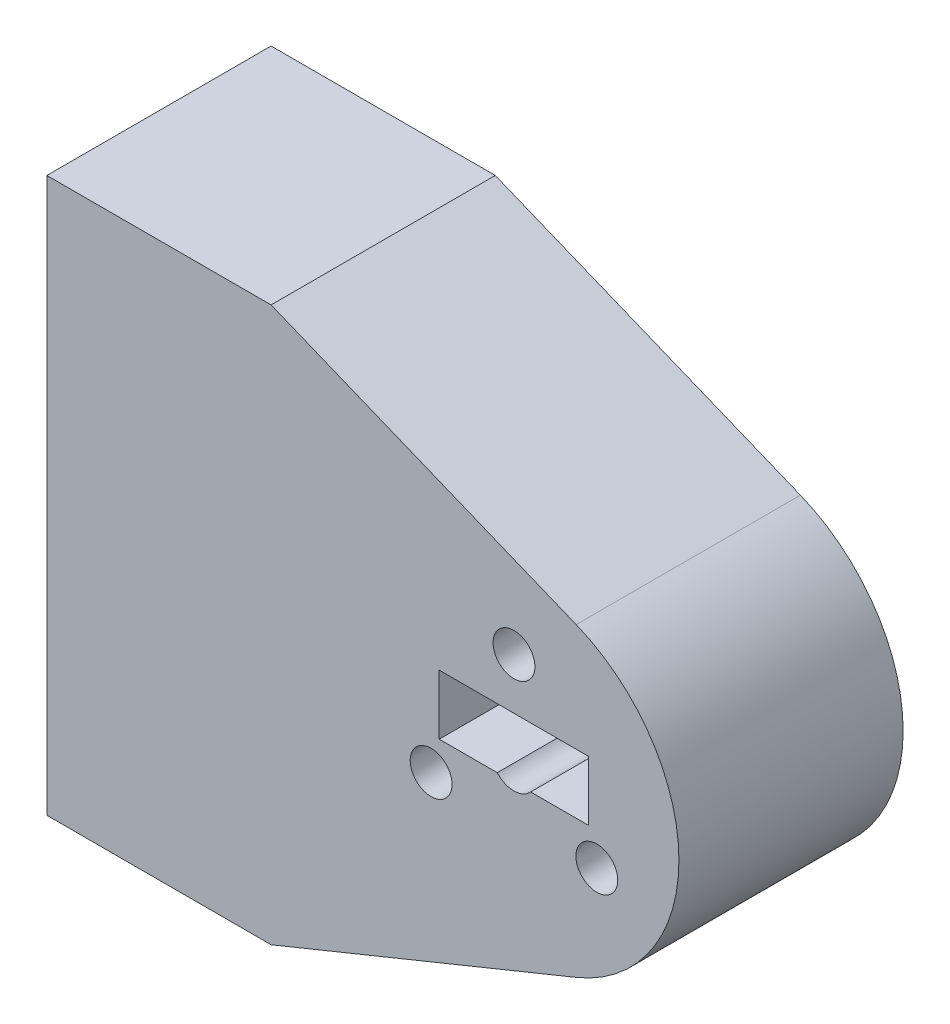
ISO-10303-21;
HEADER;
FILE_DESCRIPTION(('STEP AP214'),'2;1');
FILE_NAME('part.step','',(''),(''),'','','');
FILE_SCHEMA(('AUTOMOTIVE_DESIGN { 1 0 10303 214 1 1 1 1 }'));
ENDSEC;
DATA;
#1=APPLICATION_CONTEXT('core data for automotive mechanical design processes');
#2=APPLICATION_PROTOCOL_DEFINITION('international standard','automotive_design',2000,#1);
#3=PRODUCT_CONTEXT('',#1,'mechanical');
#4=PRODUCT('Part','Part','',(#3));
#5=PRODUCT_RELATED_PRODUCT_CATEGORY('part','',(#4));
#6=PRODUCT_DEFINITION_FORMATION('','',#4);
#7=PRODUCT_DEFINITION_CONTEXT('part definition',#1,'design');
#8=PRODUCT_DEFINITION('design','',#6,#7);
#9=PRODUCT_DEFINITION_SHAPE('','',#8);
#10=(LENGTH_UNIT() NAMED_UNIT(*) SI_UNIT(.MILLI.,.METRE.));
#11=(NAMED_UNIT(*) PLANE_ANGLE_UNIT() SI_UNIT($,.RADIAN.));
#12=(NAMED_UNIT(*) SI_UNIT($,.STERADIAN.) SOLID_ANGLE_UNIT());
#13=UNCERTAINTY_MEASURE_WITH_UNIT(LENGTH_MEASURE(1.E-05),#10,'distance_accuracy_value','');
#14=(GEOMETRIC_REPRESENTATION_CONTEXT(3) GLOBAL_UNCERTAINTY_ASSIGNED_CONTEXT((#13)) GLOBAL_UNIT_ASSIGNED_CONTEXT((#10,
#11,#12)) REPRESENTATION_CONTEXT('',''));
#15=CARTESIAN_POINT('',(0.,0.,0.));
#16=DIRECTION('',(0.,0.,1.));
#17=DIRECTION('',(1.,0.,0.));
#18=AXIS2_PLACEMENT_3D('',#15,#16,#17);
#19=CARTESIAN_POINT('',(0.,-2.,5.));
#20=DIRECTION('',(0.,-1.,0.));
#21=DIRECTION('',(1.,0.,0.));
#22=AXIS2_PLACEMENT_3D('',#19,#20,#21);
#23=PLANE('',#22);
#24=DIRECTION('',(0.,0.,1.));
#25=VECTOR('',#24,1.);
#26=CARTESIAN_POINT('',(-4.50941227933137,-2.,10.));
#27=LINE('',#26,#25);
#28=CARTESIAN_POINT('',(-4.50941227933137,-2.,0.));
#29=VERTEX_POINT('',#28);
#30=CARTESIAN_POINT('',(-4.50941227933137,-2.,12.));
#31=VERTEX_POINT('',#30);
#32=EDGE_CURVE('E450',#29,#31,#27,.T.);
#33=ORIENTED_EDGE('',*,*,#32,.T.);
#34=DIRECTION('',(-1.,0.,0.));
#35=VECTOR('',#34,1.);
#36=CARTESIAN_POINT('',(0.,-2.,12.));
#37=LINE('',#36,#35);
#38=CARTESIAN_POINT('',(-10.,-2.,12.));
#39=VERTEX_POINT('',#38);
#40=EDGE_CURVE('E433',#31,#39,#37,.T.);
#41=ORIENTED_EDGE('',*,*,#40,.T.);
#42=DIRECTION('',(0.,0.,-1.));
#43=VECTOR('',#42,1.);
#44=CARTESIAN_POINT('',(-10.,-2.,5.));
#45=LINE('',#44,#43);
#46=CARTESIAN_POINT('',(-10.,-2.,30.));
#47=VERTEX_POINT('',#46);
#48=EDGE_CURVE('E331',#47,#39,#45,.T.);
#49=ORIENTED_EDGE('',*,*,#48,.F.);
#50=DIRECTION('',(-1.,0.,0.));
#51=VECTOR('',#50,1.);
#52=CARTESIAN_POINT('',(0.,-2.,30.));
#53=LINE('',#52,#51);
#54=CARTESIAN_POINT('',(-2.23606797749979,-2.,30.));
#55=VERTEX_POINT('',#54);
#56=EDGE_CURVE('E264',#55,#47,#53,.T.);
#57=ORIENTED_EDGE('',*,*,#56,.F.);
#58=DIRECTION('',(0.,0.,-1.));
#59=VECTOR('',#58,1.);
#60=CARTESIAN_POINT('',(-2.23606797749979,-2.,5.));
#61=LINE('',#60,#59);
#62=CARTESIAN_POINT('',(-2.23606797749979,-2.,0.));
#63=VERTEX_POINT('',#62);
#64=EDGE_CURVE('E334',#55,#63,#61,.T.);
#65=ORIENTED_EDGE('',*,*,#64,.T.);
#66=DIRECTION('',(-1.,0.,0.));
#67=VECTOR('',#66,1.);
#68=CARTESIAN_POINT('',(0.,-2.,0.));
#69=LINE('',#68,#67);
#70=EDGE_CURVE('E306',#63,#29,#69,.T.);
#71=ORIENTED_EDGE('',*,*,#70,.T.);
#72=EDGE_LOOP('',(#33,#41,#49,#57,#65,#71));
#73=FACE_BOUND('',#72,.T.);
#74=ADVANCED_FACE('F46',(#73),#23,.F.);
#75=CARTESIAN_POINT('',(-10.,0.,5.));
#76=DIRECTION('',(1.,0.,0.));
#77=DIRECTION('',(0.,0.,-1.));
#78=AXIS2_PLACEMENT_3D('',#75,#76,#77);
#79=PLANE('',#78);
#80=DIRECTION('',(0.,-1.,0.));
#81=VECTOR('',#80,1.);
#82=CARTESIAN_POINT('',(-10.,-1.51916980741839,12.));
#83=LINE('',#82,#81);
#84=CARTESIAN_POINT('',(-10.,0.539957063453597,12.));
#85=VERTEX_POINT('',#84);
#86=EDGE_CURVE('E399',#39,#85,#83,.F.);
#87=ORIENTED_EDGE('',*,*,#86,.T.);
#88=DIRECTION('',(0.,0.,-1.));
#89=VECTOR('',#88,1.);
#90=CARTESIAN_POINT('',(-10.,0.539957063453597,5.));
#91=LINE('',#90,#89);
#92=CARTESIAN_POINT('',(-10.,0.539957063453597,0.));
#93=VERTEX_POINT('',#92);
#94=EDGE_CURVE('E516',#85,#93,#91,.T.);
#95=ORIENTED_EDGE('',*,*,#94,.T.);
#96=DIRECTION('',(0.,-1.,0.));
#97=VECTOR('',#96,1.);
#98=CARTESIAN_POINT('',(-10.,0.,0.));
#99=LINE('',#98,#97);
#100=CARTESIAN_POINT('',(-10.,6.,0.));
#101=VERTEX_POINT('',#100);
#102=EDGE_CURVE('E309',#101,#93,#99,.T.);
#103=ORIENTED_EDGE('',*,*,#102,.F.);
#104=DIRECTION('',(0.,0.,-1.));
#105=VECTOR('',#104,1.);
#106=CARTESIAN_POINT('',(-10.,6.,5.));
#107=LINE('',#106,#105);
#108=CARTESIAN_POINT('',(-10.,6.,30.));
#109=VERTEX_POINT('',#108);
#110=EDGE_CURVE('E329',#109,#101,#107,.T.);
#111=ORIENTED_EDGE('',*,*,#110,.F.);
#112=DIRECTION('',(0.,-1.,0.));
#113=VECTOR('',#112,1.);
#114=CARTESIAN_POINT('',(-10.,0.,30.));
#115=LINE('',#114,#113);
#116=EDGE_CURVE('E267',#109,#47,#115,.T.);
#117=ORIENTED_EDGE('',*,*,#116,.T.);
#118=ORIENTED_EDGE('',*,*,#48,.T.);
#119=EDGE_LOOP('',(#87,#95,#103,#111,#117,#118));
#120=FACE_BOUND('',#119,.T.);
#121=ADVANCED_FACE('F464',(#120),#79,.T.);
#122=CARTESIAN_POINT('',(10.,0.,5.));
#123=DIRECTION('',(1.,0.,0.));
#124=DIRECTION('',(0.,1.,0.));
#125=AXIS2_PLACEMENT_3D('',#122,#123,#124);
#126=PLANE('',#125);
#127=DIRECTION('',(0.,-1.,0.));
#128=VECTOR('',#127,1.);
#129=CARTESIAN_POINT('',(10.,0.,0.));
#130=LINE('',#129,#128);
#131=CARTESIAN_POINT('',(10.,6.,0.));
#132=VERTEX_POINT('',#131);
#133=CARTESIAN_POINT('',(10.,0.539957063453604,0.));
#134=VERTEX_POINT('',#133);
#135=EDGE_CURVE('E316',#132,#134,#130,.T.);
#136=ORIENTED_EDGE('',*,*,#135,.T.);
#137=DIRECTION('',(0.,0.,1.));
#138=VECTOR('',#137,1.);
#139=CARTESIAN_POINT('',(10.,0.539957063453604,10.));
#140=LINE('',#139,#138);
#141=CARTESIAN_POINT('',(10.,0.539957063453604,12.));
#142=VERTEX_POINT('',#141);
#143=EDGE_CURVE('E356',#134,#142,#140,.T.);
#144=ORIENTED_EDGE('',*,*,#143,.T.);
#145=DIRECTION('',(0.,-1.,0.));
#146=VECTOR('',#145,1.);
#147=CARTESIAN_POINT('',(10.,0.,12.));
#148=LINE('',#147,#146);
#149=CARTESIAN_POINT('',(10.,-2.,12.));
#150=VERTEX_POINT('',#149);
#151=EDGE_CURVE('E354',#142,#150,#148,.T.);
#152=ORIENTED_EDGE('',*,*,#151,.T.);
#153=DIRECTION('',(0.,0.,-1.));
#154=VECTOR('',#153,1.);
#155=CARTESIAN_POINT('',(10.,-2.,5.));
#156=LINE('',#155,#154);
#157=CARTESIAN_POINT('',(10.,-2.,30.));
#158=VERTEX_POINT('',#157);
#159=EDGE_CURVE('E324',#158,#150,#156,.T.);
#160=ORIENTED_EDGE('',*,*,#159,.F.);
#161=DIRECTION('',(0.,-1.,0.));
#162=VECTOR('',#161,1.);
#163=CARTESIAN_POINT('',(10.,0.,30.));
#164=LINE('',#163,#162);
#165=CARTESIAN_POINT('',(10.,6.,30.));
#166=VERTEX_POINT('',#165);
#167=EDGE_CURVE('E273',#166,#158,#164,.T.);
#168=ORIENTED_EDGE('',*,*,#167,.F.);
#169=DIRECTION('',(0.,0.,-1.));
#170=VECTOR('',#169,1.);
#171=CARTESIAN_POINT('',(10.,6.,5.));
#172=LINE('',#171,#170);
#173=EDGE_CURVE('E327',#166,#132,#172,.T.);
#174=ORIENTED_EDGE('',*,*,#173,.T.);
#175=EDGE_LOOP('',(#136,#144,#152,#160,#168,#174));
#176=FACE_BOUND('',#175,.T.);
#177=ADVANCED_FACE('F467',(#176),#126,.F.);
#178=DIRECTION('',(-1.,0.,0.));
#179=VECTOR('',#178,1.);
#180=CARTESIAN_POINT('',(0.,-2.,12.));
#181=LINE('',#180,#179);
#182=CARTESIAN_POINT('',(4.50941227933138,-2.,12.));
#183=VERTEX_POINT('',#182);
#184=EDGE_CURVE('E346',#150,#183,#181,.T.);
#185=ORIENTED_EDGE('',*,*,#184,.T.);
#186=DIRECTION('',(0.,0.,1.));
#187=VECTOR('',#186,1.);
#188=CARTESIAN_POINT('',(4.50941227933138,-2.,0.));
#189=LINE('',#188,#187);
#190=CARTESIAN_POINT('',(4.50941227933138,-2.,0.));
#191=VERTEX_POINT('',#190);
#192=EDGE_CURVE('E348',#183,#191,#189,.F.);
#193=ORIENTED_EDGE('',*,*,#192,.T.);
#194=CARTESIAN_POINT('',(2.23606797749979,-2.,0.));
#195=VERTEX_POINT('',#194);
#196=EDGE_CURVE('E310',#191,#195,#69,.T.);
#197=ORIENTED_EDGE('',*,*,#196,.T.);
#198=DIRECTION('',(0.,0.,-1.));
#199=VECTOR('',#198,1.);
#200=CARTESIAN_POINT('',(2.23606797749979,-2.,5.));
#201=LINE('',#200,#199);
#202=CARTESIAN_POINT('',(2.23606797749979,-2.,30.));
#203=VERTEX_POINT('',#202);
#204=EDGE_CURVE('E321',#203,#195,#201,.T.);
#205=ORIENTED_EDGE('',*,*,#204,.F.);
#206=DIRECTION('',(-1.,0.,0.));
#207=VECTOR('',#206,1.);
#208=CARTESIAN_POINT('',(0.,-2.,30.));
#209=LINE('',#208,#207);
#210=EDGE_CURVE('E276',#158,#203,#209,.T.);
#211=ORIENTED_EDGE('',*,*,#210,.F.);
#212=ORIENTED_EDGE('',*,*,#159,.T.);
#213=EDGE_LOOP('',(#185,#193,#197,#205,#211,#212));
#214=FACE_BOUND('',#213,.T.);
#215=ADVANCED_FACE('F466',(#214),#23,.F.);
#216=CARTESIAN_POINT('',(0.,0.,5.));
#217=DIRECTION('',(0.,0.,-1.));
#218=DIRECTION('',(-1.,0.,0.));
#219=AXIS2_PLACEMENT_3D('',#216,#217,#218);
#220=CYLINDRICAL_SURFACE('',#219,3.);
#221=CARTESIAN_POINT('',(0.,0.,0.));
#222=DIRECTION('',(0.,0.,1.));
#223=DIRECTION('',(1.,0.,0.));
#224=AXIS2_PLACEMENT_3D('',#221,#222,#223);
#225=CIRCLE('',#224,3.);
#226=EDGE_CURVE('E227',#63,#195,#225,.T.);
#227=ORIENTED_EDGE('',*,*,#226,.F.);
#228=ORIENTED_EDGE('',*,*,#64,.F.);
#229=CARTESIAN_POINT('',(0.,0.,30.));
#230=DIRECTION('',(0.,0.,1.));
#231=DIRECTION('',(1.,0.,0.));
#232=AXIS2_PLACEMENT_3D('',#229,#230,#231);
#233=CIRCLE('',#232,3.);
#234=EDGE_CURVE('E261',#55,#203,#233,.T.);
#235=ORIENTED_EDGE('',*,*,#234,.T.);
#236=ORIENTED_EDGE('',*,*,#204,.T.);
#237=EDGE_LOOP('',(#227,#228,#235,#236));
#238=FACE_BOUND('',#237,.T.);
#239=ADVANCED_FACE('F475',(#238),#220,.F.);
#240=CARTESIAN_POINT('',(0.,6.,5.));
#241=DIRECTION('',(0.,-1.,0.));
#242=DIRECTION('',(1.,0.,0.));
#243=AXIS2_PLACEMENT_3D('',#240,#241,#242);
#244=PLANE('',#243);
#245=DIRECTION('',(-1.,0.,0.));
#246=VECTOR('',#245,1.);
#247=CARTESIAN_POINT('',(0.,6.,0.));
#248=LINE('',#247,#246);
#249=EDGE_CURVE('E313',#132,#101,#248,.T.);
#250=ORIENTED_EDGE('',*,*,#249,.F.);
#251=ORIENTED_EDGE('',*,*,#173,.F.);
#252=DIRECTION('',(-1.,0.,0.));
#253=VECTOR('',#252,1.);
#254=CARTESIAN_POINT('',(0.,6.,30.));
#255=LINE('',#254,#253);
#256=EDGE_CURVE('E270',#166,#109,#255,.T.);
#257=ORIENTED_EDGE('',*,*,#256,.T.);
#258=ORIENTED_EDGE('',*,*,#110,.T.);
#259=EDGE_LOOP('',(#250,#251,#257,#258));
#260=FACE_BOUND('',#259,.T.);
#261=ADVANCED_FACE('F471',(#260),#244,.T.);
#262=CARTESIAN_POINT('',(0.,12.8,5.));
#263=DIRECTION('',(0.,0.,-1.));
#264=DIRECTION('',(-1.,0.,0.));
#265=AXIS2_PLACEMENT_3D('',#262,#263,#264);
#266=CYLINDRICAL_SURFACE('',#265,2.8);
#267=CARTESIAN_POINT('',(0.,12.8,10.));
#268=DIRECTION('',(0.,0.,1.));
#269=DIRECTION('',(1.,0.,0.));
#270=AXIS2_PLACEMENT_3D('',#267,#268,#269);
#271=CIRCLE('',#270,2.8);
#272=CARTESIAN_POINT('',(2.8,12.8,10.));
#273=VERTEX_POINT('',#272);
#274=EDGE_CURVE('E562',#273,#273,#271,.T.);
#275=ORIENTED_EDGE('',*,*,#274,.F.);
#276=EDGE_LOOP('',(#275));
#277=FACE_BOUND('',#276,.T.);
#278=CARTESIAN_POINT('',(0.,12.8,30.));
#279=DIRECTION('',(0.,0.,1.));
#280=DIRECTION('',(1.,0.,0.));
#281=AXIS2_PLACEMENT_3D('',#278,#279,#280);
#282=CIRCLE('',#281,2.8);
#283=CARTESIAN_POINT('',(2.8,12.8,30.));
#284=VERTEX_POINT('',#283);
#285=EDGE_CURVE('E282',#284,#284,#282,.T.);
#286=ORIENTED_EDGE('',*,*,#285,.T.);
#287=EDGE_LOOP('',(#286));
#288=FACE_BOUND('',#287,.T.);
#289=ADVANCED_FACE('F474',(#277,#288),#266,.F.);
#290=CARTESIAN_POINT('',(11.0851251684408,-6.4,5.));
#291=DIRECTION('',(0.,0.,-1.));
#292=DIRECTION('',(-1.,0.,0.));
#293=AXIS2_PLACEMENT_3D('',#290,#291,#292);
#294=CYLINDRICAL_SURFACE('',#293,2.8);
#295=CARTESIAN_POINT('',(9.64290465825522,-4.,10.));
#296=CARTESIAN_POINT('',(9.71595331281925,-3.95609055605296,10.0000281592697));
#297=CARTESIAN_POINT('',(9.79099210247767,-3.91554992561453,10.0014468254999));
#298=CARTESIAN_POINT('',(9.94440435266807,-3.84148600769928,10.0059389361194));
#299=CARTESIAN_POINT('',(10.0227774899307,-3.80796204180481,10.0090122204265));
#300=CARTESIAN_POINT('',(10.1823346580155,-3.74816229926325,10.0156922707784));
#301=CARTESIAN_POINT('',(10.2635223346542,-3.72189635167612,10.0192997501992));
#302=CARTESIAN_POINT('',(10.4279625414964,-3.67687668465826,10.0261426076969));
#303=CARTESIAN_POINT('',(10.511214793816,-3.65812196001168,10.0293780355235));
#304=CARTESIAN_POINT('',(10.6722687707974,-3.62949748597757,10.0345686451862));
#305=CARTESIAN_POINT('',(10.7499618004399,-3.61902823438684,10.0366066701281));
#306=CARTESIAN_POINT('',(10.9059732976984,-3.60463965252869,10.0394529055451));
#307=CARTESIAN_POINT('',(10.9842917217428,-3.60071986988606,10.0402612009578));
#308=CARTESIAN_POINT('',(11.1407479490428,-3.59946262949336,10.0405179622064));
#309=CARTESIAN_POINT('',(11.2188856031876,-3.60210577923344,10.0399704343157));
#310=CARTESIAN_POINT('',(11.3746139455313,-3.6139117610874,10.0376104773647));
#311=CARTESIAN_POINT('',(11.4522049355271,-3.62307065528124,10.0357988123236));
#312=CARTESIAN_POINT('',(11.5510582036142,-3.63895025644878,10.0328561932886));
#313=CARTESIAN_POINT('',(11.5728353132911,-3.64271373732277,10.0321679743866));
#314=CARTESIAN_POINT('',(11.6162779991363,-3.65075212241644,10.0307252816472));
#315=CARTESIAN_POINT('',(11.637943638925,-3.65502669060543,10.0299708514283));
#316=CARTESIAN_POINT('',(11.6595569458353,-3.65955694583533,10.029188358348));
#317=B_SPLINE_CURVE_WITH_KNOTS('',3,(#295,#296,#297,#298,#299,#300,#301,#302,#303,#304,#305,
#306,#307,#308,#309,#310,#311,#312,#313,#314,#315,#316),.UNSPECIFIED.,.F.,.F.,(4,2,2,2,2,2,2,2,
2,2,4),(0.,0.255549945472919,0.511075171257021,0.766944760933173,1.02278009650965,
1.25776703437204,1.49273774089419,1.72701496990269,1.96115072895215,2.02747859800106,
2.09376309502978),.UNSPECIFIED.);
#318=CARTESIAN_POINT('',(9.64290465825522,-4.,10.));
#319=VERTEX_POINT('',#318);
#320=CARTESIAN_POINT('',(11.6595569458353,-3.65955694583533,10.029188358348));
#321=VERTEX_POINT('',#320);
#322=EDGE_CURVE('E358',#319,#321,#317,.T.);
#323=ORIENTED_EDGE('',*,*,#322,.T.);
#324=CARTESIAN_POINT('',(11.6595569458353,-3.65955694583533,10.029188358348));
#325=CARTESIAN_POINT('',(11.6881514593597,-3.66554934271509,10.0242476200698));
#326=CARTESIAN_POINT('',(11.7167568808624,-3.67201397382296,10.019948368373));
#327=CARTESIAN_POINT('',(11.773824438666,-3.68586087938667,10.0126226629916));
#328=CARTESIAN_POINT('',(11.8022867528253,-3.69324059203717,10.0095927555217));
#329=CARTESIAN_POINT('',(11.8590600724687,-3.70892361366138,10.0047687727579));
#330=CARTESIAN_POINT('',(11.8873710806353,-3.71722690620408,10.0029746754824));
#331=CARTESIAN_POINT('',(11.9438403848506,-3.7347633569666,10.0005881059124));
#332=CARTESIAN_POINT('',(11.9719980479484,-3.74399900634198,9.99999894729568));
#333=CARTESIAN_POINT('',(12.,-3.75368103914521,10.));
#334=B_SPLINE_CURVE_WITH_KNOTS('',3,(#324,#325,#326,#327,#328,#329,#330,#331,#332,#333),
.UNSPECIFIED.,.F.,.F.,(4,2,2,2,4),(0.,0.0888794952683908,0.177515560624598,0.266150049345435,
0.355027964007127),.UNSPECIFIED.);
#335=CARTESIAN_POINT('',(12.,-3.75368103914521,10.));
#336=VERTEX_POINT('',#335);
#337=EDGE_CURVE('E365',#321,#336,#334,.T.);
#338=ORIENTED_EDGE('',*,*,#337,.T.);
#339=CARTESIAN_POINT('',(11.0851251684408,-6.4,10.));
#340=DIRECTION('',(0.,0.,1.));
#341=DIRECTION('',(1.,0.,0.));
#342=AXIS2_PLACEMENT_3D('',#339,#340,#341);
#343=CIRCLE('',#342,2.8);
#344=EDGE_CURVE('E556',#319,#336,#343,.T.);
#345=ORIENTED_EDGE('',*,*,#344,.F.);
#346=EDGE_LOOP('',(#323,#338,#345));
#347=FACE_BOUND('',#346,.T.);
#348=CARTESIAN_POINT('',(11.0851251684408,-6.4,30.));
#349=DIRECTION('',(0.,0.,1.));
#350=DIRECTION('',(1.,0.,0.));
#351=AXIS2_PLACEMENT_3D('',#348,#349,#350);
#352=CIRCLE('',#351,2.8);
#353=CARTESIAN_POINT('',(13.8851251684408,-6.4,30.));
#354=VERTEX_POINT('',#353);
#355=EDGE_CURVE('E258',#354,#354,#352,.T.);
#356=ORIENTED_EDGE('',*,*,#355,.T.);
#357=EDGE_LOOP('',(#356));
#358=FACE_BOUND('',#357,.T.);
#359=ADVANCED_FACE('F371',(#347,#358),#294,.F.);
#360=CARTESIAN_POINT('',(-11.0851251684408,-6.40000000000001,5.));
#361=DIRECTION('',(0.,0.,-1.));
#362=DIRECTION('',(-1.,0.,0.));
#363=AXIS2_PLACEMENT_3D('',#360,#361,#362);
#364=CYLINDRICAL_SURFACE('',#363,2.8);
#365=CARTESIAN_POINT('',(-11.0851251684408,-6.40000000000001,10.));
#366=DIRECTION('',(0.,0.,1.));
#367=DIRECTION('',(1.,0.,0.));
#368=AXIS2_PLACEMENT_3D('',#365,#366,#367);
#369=CIRCLE('',#368,2.8);
#370=CARTESIAN_POINT('',(-12.,-3.75368103914522,10.));
#371=VERTEX_POINT('',#370);
#372=CARTESIAN_POINT('',(-9.64290465825522,-4.,10.));
#373=VERTEX_POINT('',#372);
#374=EDGE_CURVE('E532',#371,#373,#369,.T.);
#375=ORIENTED_EDGE('',*,*,#374,.F.);
#376=CARTESIAN_POINT('',(-12.,-3.75368103914522,10.));
#377=CARTESIAN_POINT('',(-11.9719980479484,-3.74399900634199,9.99999894729569));
#378=CARTESIAN_POINT('',(-11.9438403848506,-3.73476335696661,10.0005881059124));
#379=CARTESIAN_POINT('',(-11.8873710806353,-3.71722690620409,10.0029746754824));
#380=CARTESIAN_POINT('',(-11.8590600724687,-3.70892361366139,10.0047687727579));
#381=CARTESIAN_POINT('',(-11.8022867528253,-3.69324059203717,10.0095927555217));
#382=CARTESIAN_POINT('',(-11.773824438666,-3.68586087938668,10.0126226629916));
#383=CARTESIAN_POINT('',(-11.7167568808624,-3.67201397382296,10.019948368373));
#384=CARTESIAN_POINT('',(-11.6881514593596,-3.6655493427151,10.0242476200698));
#385=CARTESIAN_POINT('',(-11.6595569458353,-3.65955694583534,10.029188358348));
#386=B_SPLINE_CURVE_WITH_KNOTS('',3,(#376,#377,#378,#379,#380,#381,#382,#383,#384,#385),
.UNSPECIFIED.,.F.,.F.,(4,2,2,2,4),(0.,0.088877914661688,0.177512403382527,0.266148468738734,
0.355027964007122),.UNSPECIFIED.);
#387=CARTESIAN_POINT('',(-11.6595569458353,-3.65955694583534,10.029188358348));
#388=VERTEX_POINT('',#387);
#389=EDGE_CURVE('E445',#371,#388,#386,.T.);
#390=ORIENTED_EDGE('',*,*,#389,.T.);
#391=CARTESIAN_POINT('',(-11.6595569458353,-3.65955694583534,10.029188358348));
#392=CARTESIAN_POINT('',(-11.6178411672509,-3.65081287745218,10.0307008718836));
#393=CARTESIAN_POINT('',(-11.5759276819828,-3.64302175103574,10.0321043229975));
#394=CARTESIAN_POINT('',(-11.4917803334101,-3.62935943836481,10.034631019393));
#395=CARTESIAN_POINT('',(-11.4495464677354,-3.62348826632808,10.0357542625995));
#396=CARTESIAN_POINT('',(-11.3224976135332,-3.60877823527897,10.0386100799582));
#397=CARTESIAN_POINT('',(-11.2373157701024,-3.60283875522701,10.0398295079502));
#398=CARTESIAN_POINT('',(-11.0667998745848,-3.5987614664035,10.0406605999013));
#399=CARTESIAN_POINT('',(-10.9814658854603,-3.60062095524904,10.0402728207666));
#400=CARTESIAN_POINT('',(-10.8113578890641,-3.61211234356504,10.0379659497392));
#401=CARTESIAN_POINT('',(-10.7265837814141,-3.62174280945703,10.0360471402895));
#402=CARTESIAN_POINT('',(-10.5658539698581,-3.64747928598031,10.0312736903018));
#403=CARTESIAN_POINT('',(-10.489789674746,-3.66292654273021,10.0285184966929));
#404=CARTESIAN_POINT('',(-10.3392153665844,-3.70006498996915,10.0225297172268));
#405=CARTESIAN_POINT('',(-10.2647061679311,-3.72175936820447,10.0192958875444));
#406=CARTESIAN_POINT('',(-10.0446870865227,-3.79590591300872,10.0098097220639));
#407=CARTESIAN_POINT('',(-9.90204344667961,-3.85752480942121,10.0037443109381));
#408=CARTESIAN_POINT('',(-9.74492681123162,-3.94145816848701,10.0008270637712));
#409=CARTESIAN_POINT('',(-9.72431039622613,-3.9528097793164,10.0005234916516));
#410=CARTESIAN_POINT('',(-9.6833825623611,-3.97602231802944,10.0001096672878));
#411=CARTESIAN_POINT('',(-9.66307094912083,-3.98788290092103,9.99999928615057));
#412=CARTESIAN_POINT('',(-9.64290465825522,-4.,10.));
#413=B_SPLINE_CURVE_WITH_KNOTS('',3,(#391,#392,#393,#394,#395,#396,#397,#398,#399,#400,#401,
#402,#403,#404,#405,#406,#407,#408,#409,#410,#411,#412),.UNSPECIFIED.,.F.,.F.,(4,2,2,2,2,2,2,2,
2,2,4),(0.,0.127924357700844,0.25584966269249,0.511640391275548,0.767342494377175,
1.022997436711,1.25570735618544,1.48853623264131,1.95226193781463,2.02287190963885,
2.09343475399894),.UNSPECIFIED.);
#414=EDGE_CURVE('E451',#388,#373,#413,.T.);
#415=ORIENTED_EDGE('',*,*,#414,.T.);
#416=EDGE_LOOP('',(#375,#390,#415));
#417=FACE_BOUND('',#416,.T.);
#418=CARTESIAN_POINT('',(-11.0851251684408,-6.40000000000001,30.));
#419=DIRECTION('',(0.,0.,1.));
#420=DIRECTION('',(1.,0.,0.));
#421=AXIS2_PLACEMENT_3D('',#418,#419,#420);
#422=CIRCLE('',#421,2.8);
#423=CARTESIAN_POINT('',(-8.28512516844081,-6.40000000000001,30.));
#424=VERTEX_POINT('',#423);
#425=EDGE_CURVE('E279',#424,#424,#422,.T.);
#426=ORIENTED_EDGE('',*,*,#425,.T.);
#427=EDGE_LOOP('',(#426));
#428=FACE_BOUND('',#427,.T.);
#429=ADVANCED_FACE('F456',(#417,#428),#364,.F.);
#430=CARTESIAN_POINT('',(0.,0.,5.));
#431=DIRECTION('',(0.,0.,-1.));
#432=DIRECTION('',(-1.,0.,0.));
#433=AXIS2_PLACEMENT_3D('',#430,#431,#432);
#434=CYLINDRICAL_SURFACE('',#433,22.0716390642382);
#435=CARTESIAN_POINT('',(0.,0.,0.));
#436=DIRECTION('',(0.,0.,1.));
#437=DIRECTION('',(1.,0.,0.));
#438=AXIS2_PLACEMENT_3D('',#435,#436,#437);
#439=CIRCLE('',#438,22.0716390642382);
#440=CARTESIAN_POINT('',(8.32662123293452,-20.4407590325127,0.));
#441=VERTEX_POINT('',#440);
#442=CARTESIAN_POINT('',(8.32662123293451,20.4407590325127,0.));
#443=VERTEX_POINT('',#442);
#444=EDGE_CURVE('E319',#441,#443,#439,.T.);
#445=ORIENTED_EDGE('',*,*,#444,.T.);
#446=DIRECTION('',(0.,0.,-1.));
#447=VECTOR('',#446,1.);
#448=CARTESIAN_POINT('',(8.32662123293452,20.4407590325127,30.));
#449=LINE('',#448,#447);
#450=CARTESIAN_POINT('',(8.32662123293452,20.4407590325127,30.));
#451=VERTEX_POINT('',#450);
#452=EDGE_CURVE('E228',#451,#443,#449,.T.);
#453=ORIENTED_EDGE('',*,*,#452,.F.);
#454=CARTESIAN_POINT('',(0.,0.,30.));
#455=DIRECTION('',(0.,0.,1.));
#456=DIRECTION('',(1.,0.,0.));
#457=AXIS2_PLACEMENT_3D('',#454,#455,#456);
#458=CIRCLE('',#457,22.0716390642382);
#459=CARTESIAN_POINT('',(8.32662123293452,-20.4407590325127,30.));
#460=VERTEX_POINT('',#459);
#461=EDGE_CURVE('E231',#460,#451,#458,.T.);
#462=ORIENTED_EDGE('',*,*,#461,.F.);
#463=DIRECTION('',(0.,0.,-1.));
#464=VECTOR('',#463,1.);
#465=CARTESIAN_POINT('',(8.32662123293452,-20.4407590325127,30.));
#466=LINE('',#465,#464);
#467=EDGE_CURVE('E216',#460,#441,#466,.T.);
#468=ORIENTED_EDGE('',*,*,#467,.T.);
#469=EDGE_LOOP('',(#445,#453,#462,#468));
#470=FACE_BOUND('',#469,.T.);
#471=ADVANCED_FACE('F232',(#470),#434,.T.);
#472=CARTESIAN_POINT('',(0.,0.,0.));
#473=DIRECTION('',(0.,0.,1.));
#474=DIRECTION('',(1.,0.,0.));
#475=AXIS2_PLACEMENT_3D('',#472,#473,#474);
#476=PLANE('',#475);
#477=ORIENTED_EDGE('',*,*,#102,.T.);
#478=CARTESIAN_POINT('',(-12.,0.539957063453597,0.));
#479=DIRECTION('',(0.,0.,1.));
#480=DIRECTION('',(1.,0.,0.));
#481=AXIS2_PLACEMENT_3D('',#478,#479,#480);
#482=CIRCLE('',#481,2.);
#483=CARTESIAN_POINT('',(-11.7386071909831,-1.44288781181886,0.));
#484=VERTEX_POINT('',#483);
#485=EDGE_CURVE('E523',#93,#484,#482,.F.);
#486=ORIENTED_EDGE('',*,*,#485,.T.);
#487=CARTESIAN_POINT('',(-11.0851251684408,-6.40000000000001,0.));
#488=DIRECTION('',(0.,0.,1.));
#489=DIRECTION('',(1.,0.,0.));
#490=AXIS2_PLACEMENT_3D('',#487,#488,#489);
#491=CIRCLE('',#490,5.);
#492=CARTESIAN_POINT('',(-6.3881873905055,-4.68571428571429,0.));
#493=VERTEX_POINT('',#492);
#494=EDGE_CURVE('E336',#493,#484,#491,.F.);
#495=ORIENTED_EDGE('',*,*,#494,.F.);
#496=CARTESIAN_POINT('',(-4.50941227933137,-4.,0.));
#497=DIRECTION('',(0.,0.,1.));
#498=DIRECTION('',(1.,0.,0.));
#499=AXIS2_PLACEMENT_3D('',#496,#497,#498);
#500=CIRCLE('',#499,2.);
#501=EDGE_CURVE('E495',#493,#29,#500,.F.);
#502=ORIENTED_EDGE('',*,*,#501,.T.);
#503=ORIENTED_EDGE('',*,*,#70,.F.);
#504=ORIENTED_EDGE('',*,*,#226,.T.);
#505=ORIENTED_EDGE('',*,*,#196,.F.);
#506=CARTESIAN_POINT('',(4.50941227933138,-4.,0.));
#507=DIRECTION('',(0.,0.,1.));
#508=DIRECTION('',(1.,0.,0.));
#509=AXIS2_PLACEMENT_3D('',#506,#507,#508);
#510=CIRCLE('',#509,2.);
#511=CARTESIAN_POINT('',(6.3881873905055,-4.68571428571428,0.));
#512=VERTEX_POINT('',#511);
#513=EDGE_CURVE('E352',#191,#512,#510,.F.);
#514=ORIENTED_EDGE('',*,*,#513,.T.);
#515=CARTESIAN_POINT('',(11.0851251684408,-6.4,0.));
#516=DIRECTION('',(0.,0.,1.));
#517=DIRECTION('',(1.,0.,0.));
#518=AXIS2_PLACEMENT_3D('',#515,#516,#517);
#519=CIRCLE('',#518,5.);
#520=CARTESIAN_POINT('',(11.7386071909831,-1.44288781181885,0.));
#521=VERTEX_POINT('',#520);
#522=EDGE_CURVE('E338',#521,#512,#519,.F.);
#523=ORIENTED_EDGE('',*,*,#522,.F.);
#524=CARTESIAN_POINT('',(12.,0.539957063453604,0.));
#525=DIRECTION('',(0.,0.,1.));
#526=DIRECTION('',(1.,0.,0.));
#527=AXIS2_PLACEMENT_3D('',#524,#525,#526);
#528=CIRCLE('',#527,2.);
#529=EDGE_CURVE('E350',#521,#134,#528,.F.);
#530=ORIENTED_EDGE('',*,*,#529,.T.);
#531=ORIENTED_EDGE('',*,*,#135,.F.);
#532=ORIENTED_EDGE('',*,*,#249,.T.);
#533=EDGE_LOOP('',(#477,#486,#495,#502,#503,#504,#505,#514,#523,#530,#531,#532));
#534=FACE_BOUND('',#533,.T.);
#535=CARTESIAN_POINT('',(0.,12.8,0.));
#536=DIRECTION('',(0.,0.,1.));
#537=DIRECTION('',(1.,0.,0.));
#538=AXIS2_PLACEMENT_3D('',#535,#536,#537);
#539=CIRCLE('',#538,5.);
#540=CARTESIAN_POINT('',(5.,12.8,0.));
#541=VERTEX_POINT('',#540);
#542=EDGE_CURVE('E565',#541,#541,#539,.T.);
#543=ORIENTED_EDGE('',*,*,#542,.T.);
#544=EDGE_LOOP('',(#543));
#545=FACE_BOUND('',#544,.T.);
#546=ORIENTED_EDGE('',*,*,#444,.F.);
#547=DIRECTION('',(0.926109700010094,0.377254322105413,0.));
#548=VECTOR('',#547,1.);
#549=CARTESIAN_POINT('',(8.32662123293452,-20.4407590325127,0.));
#550=LINE('',#549,#548);
#551=CARTESIAN_POINT('',(-32.5,-37.0716390642382,0.));
#552=VERTEX_POINT('',#551);
#553=EDGE_CURVE('E223',#552,#441,#550,.T.);
#554=ORIENTED_EDGE('',*,*,#553,.F.);
#555=DIRECTION('',(1.,0.,0.));
#556=VECTOR('',#555,1.);
#557=CARTESIAN_POINT('',(0.,-37.0716390642382,0.));
#558=LINE('',#557,#556);
#559=CARTESIAN_POINT('',(-62.5,-37.0716390642382,0.));
#560=VERTEX_POINT('',#559);
#561=EDGE_CURVE('E243',#560,#552,#558,.T.);
#562=ORIENTED_EDGE('',*,*,#561,.F.);
#563=DIRECTION('',(0.,-1.,0.));
#564=VECTOR('',#563,1.);
#565=CARTESIAN_POINT('',(-62.5,0.,0.));
#566=LINE('',#565,#564);
#567=CARTESIAN_POINT('',(-62.5,37.0716390642382,0.));
#568=VERTEX_POINT('',#567);
#569=EDGE_CURVE('E245',#568,#560,#566,.T.);
#570=ORIENTED_EDGE('',*,*,#569,.F.);
#571=DIRECTION('',(1.,0.,0.));
#572=VECTOR('',#571,1.);
#573=CARTESIAN_POINT('',(0.,37.0716390642382,0.));
#574=LINE('',#573,#572);
#575=CARTESIAN_POINT('',(-32.5,37.0716390642382,0.));
#576=VERTEX_POINT('',#575);
#577=EDGE_CURVE('E291',#568,#576,#574,.T.);
#578=ORIENTED_EDGE('',*,*,#577,.T.);
#579=DIRECTION('',(0.926109700010094,-0.377254322105412,0.));
#580=VECTOR('',#579,1.);
#581=CARTESIAN_POINT('',(8.32662123293451,20.4407590325127,0.));
#582=LINE('',#581,#580);
#583=EDGE_CURVE('E287',#576,#443,#582,.T.);
#584=ORIENTED_EDGE('',*,*,#583,.T.);
#585=EDGE_LOOP('',(#546,#554,#562,#570,#578,#584));
#586=FACE_BOUND('',#585,.T.);
#587=ADVANCED_FACE('F490',(#534,#545,#586),#476,.F.);
#588=CARTESIAN_POINT('',(8.32662123293452,-20.4407590325127,30.));
#589=DIRECTION('',(-0.377254322105413,0.926109700010094,0.));
#590=DIRECTION('',(-0.926109700010094,-0.377254322105413,0.));
#591=AXIS2_PLACEMENT_3D('',#588,#589,#590);
#592=PLANE('',#591);
#593=ORIENTED_EDGE('',*,*,#553,.T.);
#594=ORIENTED_EDGE('',*,*,#467,.F.);
#595=DIRECTION('',(0.926109700010094,0.377254322105413,0.));
#596=VECTOR('',#595,1.);
#597=CARTESIAN_POINT('',(8.32662123293452,-20.4407590325127,30.));
#598=LINE('',#597,#596);
#599=CARTESIAN_POINT('',(-32.5,-37.0716390642382,30.));
#600=VERTEX_POINT('',#599);
#601=EDGE_CURVE('E221',#600,#460,#598,.T.);
#602=ORIENTED_EDGE('',*,*,#601,.F.);
#603=DIRECTION('',(0.,0.,-1.));
#604=VECTOR('',#603,1.);
#605=CARTESIAN_POINT('',(-32.5,-37.0716390642382,30.));
#606=LINE('',#605,#604);
#607=EDGE_CURVE('E285',#600,#552,#606,.T.);
#608=ORIENTED_EDGE('',*,*,#607,.T.);
#609=EDGE_LOOP('',(#593,#594,#602,#608));
#610=FACE_BOUND('',#609,.T.);
#611=ADVANCED_FACE('F218',(#610),#592,.F.);
#612=CARTESIAN_POINT('',(8.32662123293451,20.4407590325127,30.));
#613=DIRECTION('',(0.377254322105412,0.926109700010094,0.));
#614=DIRECTION('',(-0.926109700010094,0.377254322105412,0.));
#615=AXIS2_PLACEMENT_3D('',#612,#613,#614);
#616=PLANE('',#615);
#617=ORIENTED_EDGE('',*,*,#583,.F.);
#618=DIRECTION('',(0.,0.,-1.));
#619=VECTOR('',#618,1.);
#620=CARTESIAN_POINT('',(-32.5,37.0716390642382,30.));
#621=LINE('',#620,#619);
#622=CARTESIAN_POINT('',(-32.5,37.0716390642382,30.));
#623=VERTEX_POINT('',#622);
#624=EDGE_CURVE('E301',#623,#576,#621,.T.);
#625=ORIENTED_EDGE('',*,*,#624,.F.);
#626=DIRECTION('',(0.926109700010094,-0.377254322105412,0.));
#627=VECTOR('',#626,1.);
#628=CARTESIAN_POINT('',(8.32662123293451,20.4407590325127,30.));
#629=LINE('',#628,#627);
#630=EDGE_CURVE('E236',#623,#451,#629,.T.);
#631=ORIENTED_EDGE('',*,*,#630,.T.);
#632=ORIENTED_EDGE('',*,*,#452,.T.);
#633=EDGE_LOOP('',(#617,#625,#631,#632));
#634=FACE_BOUND('',#633,.T.);
#635=ADVANCED_FACE('F605',(#634),#616,.T.);
#636=CARTESIAN_POINT('',(0.,37.0716390642382,30.));
#637=DIRECTION('',(0.,1.,0.));
#638=DIRECTION('',(0.,0.,1.));
#639=AXIS2_PLACEMENT_3D('',#636,#637,#638);
#640=PLANE('',#639);
#641=ORIENTED_EDGE('',*,*,#577,.F.);
#642=DIRECTION('',(0.,0.,-1.));
#643=VECTOR('',#642,1.);
#644=CARTESIAN_POINT('',(-62.5,37.0716390642382,30.));
#645=LINE('',#644,#643);
#646=CARTESIAN_POINT('',(-62.5,37.0716390642382,30.));
#647=VERTEX_POINT('',#646);
#648=EDGE_CURVE('E299',#647,#568,#645,.T.);
#649=ORIENTED_EDGE('',*,*,#648,.F.);
#650=DIRECTION('',(1.,0.,0.));
#651=VECTOR('',#650,1.);
#652=CARTESIAN_POINT('',(0.,37.0716390642382,30.));
#653=LINE('',#652,#651);
#654=EDGE_CURVE('E252',#647,#623,#653,.T.);
#655=ORIENTED_EDGE('',*,*,#654,.T.);
#656=ORIENTED_EDGE('',*,*,#624,.T.);
#657=EDGE_LOOP('',(#641,#649,#655,#656));
#658=FACE_BOUND('',#657,.T.);
#659=ADVANCED_FACE('F599',(#658),#640,.T.);
#660=CARTESIAN_POINT('',(-62.5,0.,30.));
#661=DIRECTION('',(1.,0.,0.));
#662=DIRECTION('',(0.,1.,0.));
#663=AXIS2_PLACEMENT_3D('',#660,#661,#662);
#664=PLANE('',#663);
#665=ORIENTED_EDGE('',*,*,#569,.T.);
#666=DIRECTION('',(0.,0.,-1.));
#667=VECTOR('',#666,1.);
#668=CARTESIAN_POINT('',(-62.5,-37.0716390642382,30.));
#669=LINE('',#668,#667);
#670=CARTESIAN_POINT('',(-62.5,-37.0716390642382,30.));
#671=VERTEX_POINT('',#670);
#672=EDGE_CURVE('E296',#671,#560,#669,.T.);
#673=ORIENTED_EDGE('',*,*,#672,.F.);
#674=DIRECTION('',(0.,-1.,0.));
#675=VECTOR('',#674,1.);
#676=CARTESIAN_POINT('',(-62.5,0.,30.));
#677=LINE('',#676,#675);
#678=EDGE_CURVE('E255',#647,#671,#677,.T.);
#679=ORIENTED_EDGE('',*,*,#678,.F.);
#680=ORIENTED_EDGE('',*,*,#648,.T.);
#681=EDGE_LOOP('',(#665,#673,#679,#680));
#682=FACE_BOUND('',#681,.T.);
#683=ADVANCED_FACE('F594',(#682),#664,.F.);
#684=CARTESIAN_POINT('',(0.,-37.0716390642382,30.));
#685=DIRECTION('',(0.,1.,0.));
#686=DIRECTION('',(0.,0.,1.));
#687=AXIS2_PLACEMENT_3D('',#684,#685,#686);
#688=PLANE('',#687);
#689=ORIENTED_EDGE('',*,*,#561,.T.);
#690=ORIENTED_EDGE('',*,*,#607,.F.);
#691=DIRECTION('',(1.,0.,0.));
#692=VECTOR('',#691,1.);
#693=CARTESIAN_POINT('',(0.,-37.0716390642382,30.));
#694=LINE('',#693,#692);
#695=EDGE_CURVE('E241',#671,#600,#694,.T.);
#696=ORIENTED_EDGE('',*,*,#695,.F.);
#697=ORIENTED_EDGE('',*,*,#672,.T.);
#698=EDGE_LOOP('',(#689,#690,#696,#697));
#699=FACE_BOUND('',#698,.T.);
#700=ADVANCED_FACE('F590',(#699),#688,.F.);
#701=CARTESIAN_POINT('',(0.,0.,30.));
#702=DIRECTION('',(0.,0.,1.));
#703=DIRECTION('',(1.,0.,0.));
#704=AXIS2_PLACEMENT_3D('',#701,#702,#703);
#705=PLANE('',#704);
#706=ORIENTED_EDGE('',*,*,#601,.T.);
#707=ORIENTED_EDGE('',*,*,#461,.T.);
#708=ORIENTED_EDGE('',*,*,#630,.F.);
#709=ORIENTED_EDGE('',*,*,#654,.F.);
#710=ORIENTED_EDGE('',*,*,#678,.T.);
#711=ORIENTED_EDGE('',*,*,#695,.T.);
#712=EDGE_LOOP('',(#706,#707,#708,#709,#710,#711));
#713=FACE_BOUND('',#712,.T.);
#714=ORIENTED_EDGE('',*,*,#355,.F.);
#715=EDGE_LOOP('',(#714));
#716=FACE_BOUND('',#715,.T.);
#717=ORIENTED_EDGE('',*,*,#234,.F.);
#718=ORIENTED_EDGE('',*,*,#56,.T.);
#719=ORIENTED_EDGE('',*,*,#116,.F.);
#720=ORIENTED_EDGE('',*,*,#256,.F.);
#721=ORIENTED_EDGE('',*,*,#167,.T.);
#722=ORIENTED_EDGE('',*,*,#210,.T.);
#723=EDGE_LOOP('',(#717,#718,#719,#720,#721,#722));
#724=FACE_BOUND('',#723,.T.);
#725=ORIENTED_EDGE('',*,*,#425,.F.);
#726=EDGE_LOOP('',(#725));
#727=FACE_BOUND('',#726,.T.);
#728=ORIENTED_EDGE('',*,*,#285,.F.);
#729=EDGE_LOOP('',(#728));
#730=FACE_BOUND('',#729,.T.);
#731=ADVANCED_FACE('F238',(#713,#716,#724,#727,#730),#705,.T.);
#732=CARTESIAN_POINT('',(0.,0.,10.));
#733=DIRECTION('',(0.,0.,1.));
#734=DIRECTION('',(1.,0.,0.));
#735=AXIS2_PLACEMENT_3D('',#732,#733,#734);
#736=PLANE('',#735);
#737=CARTESIAN_POINT('',(-11.0851251684408,-6.40000000000001,10.));
#738=DIRECTION('',(0.,0.,1.));
#739=DIRECTION('',(1.,0.,0.));
#740=AXIS2_PLACEMENT_3D('',#737,#738,#739);
#741=CIRCLE('',#740,5.);
#742=CARTESIAN_POINT('',(-12.,-1.48441213662298,10.));
#743=VERTEX_POINT('',#742);
#744=CARTESIAN_POINT('',(-6.3881873905055,-4.68571428571429,10.));
#745=VERTEX_POINT('',#744);
#746=EDGE_CURVE('E248',#743,#745,#741,.T.);
#747=ORIENTED_EDGE('',*,*,#746,.F.);
#748=DIRECTION('',(0.,-1.,0.));
#749=VECTOR('',#748,1.);
#750=CARTESIAN_POINT('',(-12.,-2.,10.));
#751=LINE('',#750,#749);
#752=EDGE_CURVE('E528',#743,#371,#751,.T.);
#753=ORIENTED_EDGE('',*,*,#752,.T.);
#754=ORIENTED_EDGE('',*,*,#374,.T.);
#755=DIRECTION('',(-1.,0.,0.));
#756=VECTOR('',#755,1.);
#757=CARTESIAN_POINT('',(0.,-4.,10.));
#758=LINE('',#757,#756);
#759=CARTESIAN_POINT('',(-6.50941227933137,-4.,10.));
#760=VERTEX_POINT('',#759);
#761=EDGE_CURVE('E62',#373,#760,#758,.F.);
#762=ORIENTED_EDGE('',*,*,#761,.T.);
#763=CARTESIAN_POINT('',(-4.50941227933137,-4.,10.));
#764=DIRECTION('',(0.,0.,1.));
#765=DIRECTION('',(1.,0.,0.));
#766=AXIS2_PLACEMENT_3D('',#763,#764,#765);
#767=CIRCLE('',#766,2.);
#768=EDGE_CURVE('E13',#760,#745,#767,.T.);
#769=ORIENTED_EDGE('',*,*,#768,.T.);
#770=EDGE_LOOP('',(#747,#753,#754,#762,#769));
#771=FACE_BOUND('',#770,.T.);
#772=ADVANCED_FACE('F420',(#771),#736,.F.);
#773=CARTESIAN_POINT('',(-11.0851251684408,-6.40000000000001,10.));
#774=DIRECTION('',(0.,0.,-1.));
#775=DIRECTION('',(-1.,0.,0.));
#776=AXIS2_PLACEMENT_3D('',#773,#774,#775);
#777=CYLINDRICAL_SURFACE('',#776,5.);
#778=ORIENTED_EDGE('',*,*,#494,.T.);
#779=DIRECTION('',(0.,0.,-1.));
#780=VECTOR('',#779,1.);
#781=CARTESIAN_POINT('',(-11.7386071909831,-1.44288781181886,10.));
#782=LINE('',#781,#780);
#783=CARTESIAN_POINT('',(-11.7386071909831,-1.44288781181886,10.0171551247275));
#784=VERTEX_POINT('',#783);
#785=EDGE_CURVE('E70',#484,#784,#782,.F.);
#786=ORIENTED_EDGE('',*,*,#785,.T.);
#787=CARTESIAN_POINT('',(-11.7386071909831,-1.44288781181886,10.0171551247275));
#788=CARTESIAN_POINT('',(-11.782172244578,-1.44862611733902,10.0114275604142));
#789=CARTESIAN_POINT('',(-11.8257375054598,-1.45495563049938,10.0071341845302));
#790=CARTESIAN_POINT('',(-11.9128684417987,-1.46879707210071,10.0014158096209));
#791=CARTESIAN_POINT('',(-11.9564341172559,-1.47630900054173,9.9999908105957));
#792=CARTESIAN_POINT('',(-12.,-1.48441213662298,10.));
#793=B_SPLINE_CURVE_WITH_KNOTS('',3,(#787,#788,#789,#790,#791,#792),.UNSPECIFIED.,.F.,.F.,(4,2,
4),(0.,0.13269457381992,0.265389147644459),.UNSPECIFIED.);
#794=EDGE_CURVE('E55',#784,#743,#793,.T.);
#795=ORIENTED_EDGE('',*,*,#794,.T.);
#796=ORIENTED_EDGE('',*,*,#746,.T.);
#797=DIRECTION('',(0.,0.,-1.));
#798=VECTOR('',#797,1.);
#799=CARTESIAN_POINT('',(-6.3881873905055,-4.68571428571429,10.));
#800=LINE('',#799,#798);
#801=EDGE_CURVE('E525',#745,#493,#800,.T.);
#802=ORIENTED_EDGE('',*,*,#801,.T.);
#803=EDGE_LOOP('',(#778,#786,#795,#796,#802));
#804=FACE_BOUND('',#803,.T.);
#805=ADVANCED_FACE('F418',(#804),#777,.F.);
#806=CARTESIAN_POINT('',(0.,12.8,10.));
#807=DIRECTION('',(0.,0.,-1.));
#808=DIRECTION('',(-1.,0.,0.));
#809=AXIS2_PLACEMENT_3D('',#806,#807,#808);
#810=CYLINDRICAL_SURFACE('',#809,5.);
#811=CARTESIAN_POINT('',(0.,12.8,10.));
#812=DIRECTION('',(0.,0.,1.));
#813=DIRECTION('',(1.,0.,0.));
#814=AXIS2_PLACEMENT_3D('',#811,#812,#813);
#815=CIRCLE('',#814,5.);
#816=CARTESIAN_POINT('',(5.,12.8,10.));
#817=VERTEX_POINT('',#816);
#818=EDGE_CURVE('E559',#817,#817,#815,.T.);
#819=ORIENTED_EDGE('',*,*,#818,.T.);
#820=EDGE_LOOP('',(#819));
#821=FACE_BOUND('',#820,.T.);
#822=ORIENTED_EDGE('',*,*,#542,.F.);
#823=EDGE_LOOP('',(#822));
#824=FACE_BOUND('',#823,.T.);
#825=ADVANCED_FACE('F414',(#821,#824),#810,.F.);
#826=CARTESIAN_POINT('',(0.,0.,10.));
#827=DIRECTION('',(0.,0.,1.));
#828=DIRECTION('',(1.,0.,0.));
#829=AXIS2_PLACEMENT_3D('',#826,#827,#828);
#830=PLANE('',#829);
#831=ORIENTED_EDGE('',*,*,#274,.T.);
#832=EDGE_LOOP('',(#831));
#833=FACE_BOUND('',#832,.T.);
#834=ORIENTED_EDGE('',*,*,#818,.F.);
#835=EDGE_LOOP('',(#834));
#836=FACE_BOUND('',#835,.T.);
#837=ADVANCED_FACE('F411',(#833,#836),#830,.F.);
#838=CARTESIAN_POINT('',(0.,0.,10.));
#839=DIRECTION('',(0.,0.,1.));
#840=DIRECTION('',(1.,0.,0.));
#841=AXIS2_PLACEMENT_3D('',#838,#839,#840);
#842=PLANE('',#841);
#843=ORIENTED_EDGE('',*,*,#344,.T.);
#844=DIRECTION('',(0.,-1.,0.));
#845=VECTOR('',#844,1.);
#846=CARTESIAN_POINT('',(12.,0.,10.));
#847=LINE('',#846,#845);
#848=CARTESIAN_POINT('',(12.,-1.48441213662297,10.));
#849=VERTEX_POINT('',#848);
#850=EDGE_CURVE('E583',#336,#849,#847,.F.);
#851=ORIENTED_EDGE('',*,*,#850,.T.);
#852=CARTESIAN_POINT('',(11.0851251684408,-6.4,10.));
#853=DIRECTION('',(0.,0.,1.));
#854=DIRECTION('',(1.,0.,0.));
#855=AXIS2_PLACEMENT_3D('',#852,#853,#854);
#856=CIRCLE('',#855,5.);
#857=CARTESIAN_POINT('',(6.3881873905055,-4.68571428571428,10.));
#858=VERTEX_POINT('',#857);
#859=EDGE_CURVE('E288',#858,#849,#856,.T.);
#860=ORIENTED_EDGE('',*,*,#859,.F.);
#861=CARTESIAN_POINT('',(4.50941227933138,-4.,10.));
#862=DIRECTION('',(0.,0.,1.));
#863=DIRECTION('',(1.,0.,0.));
#864=AXIS2_PLACEMENT_3D('',#861,#862,#863);
#865=CIRCLE('',#864,2.);
#866=CARTESIAN_POINT('',(6.50941227933138,-4.,10.));
#867=VERTEX_POINT('',#866);
#868=EDGE_CURVE('E400',#858,#867,#865,.T.);
#869=ORIENTED_EDGE('',*,*,#868,.T.);
#870=DIRECTION('',(-1.,0.,0.));
#871=VECTOR('',#870,1.);
#872=CARTESIAN_POINT('',(0.,-4.,10.));
#873=LINE('',#872,#871);
#874=EDGE_CURVE('E581',#867,#319,#873,.F.);
#875=ORIENTED_EDGE('',*,*,#874,.T.);
#876=EDGE_LOOP('',(#843,#851,#860,#869,#875));
#877=FACE_BOUND('',#876,.T.);
#878=ADVANCED_FACE('F409',(#877),#842,.F.);
#879=CARTESIAN_POINT('',(11.0851251684408,-6.4,10.));
#880=DIRECTION('',(0.,0.,-1.));
#881=DIRECTION('',(-1.,0.,0.));
#882=AXIS2_PLACEMENT_3D('',#879,#880,#881);
#883=CYLINDRICAL_SURFACE('',#882,5.);
#884=ORIENTED_EDGE('',*,*,#522,.T.);
#885=DIRECTION('',(0.,0.,-1.));
#886=VECTOR('',#885,1.);
#887=CARTESIAN_POINT('',(6.3881873905055,-4.68571428571428,10.));
#888=LINE('',#887,#886);
#889=EDGE_CURVE('E343',#512,#858,#888,.F.);
#890=ORIENTED_EDGE('',*,*,#889,.T.);
#891=ORIENTED_EDGE('',*,*,#859,.T.);
#892=CARTESIAN_POINT('',(12.,-1.48441213662297,10.));
#893=CARTESIAN_POINT('',(11.9564341172559,-1.47630900054172,9.99999081059571));
#894=CARTESIAN_POINT('',(11.9128684417987,-1.4687970721007,10.0014158096209));
#895=CARTESIAN_POINT('',(11.8257375054598,-1.45495563049937,10.0071341845302));
#896=CARTESIAN_POINT('',(11.782172244578,-1.44862611733902,10.0114275604141));
#897=CARTESIAN_POINT('',(11.7386071909831,-1.44288781181885,10.0171551247275));
#898=B_SPLINE_CURVE_WITH_KNOTS('',3,(#892,#893,#894,#895,#896,#897),.UNSPECIFIED.,.F.,.F.,(4,2,
4),(0.,0.132694573824539,0.265389147644457),.UNSPECIFIED.);
#899=CARTESIAN_POINT('',(11.7386071909831,-1.44288781181885,10.0171551247275));
#900=VERTEX_POINT('',#899);
#901=EDGE_CURVE('E391',#849,#900,#898,.T.);
#902=ORIENTED_EDGE('',*,*,#901,.T.);
#903=DIRECTION('',(0.,0.,-1.));
#904=VECTOR('',#903,1.);
#905=CARTESIAN_POINT('',(11.7386071909831,-1.44288781181885,10.));
#906=LINE('',#905,#904);
#907=EDGE_CURVE('E341',#900,#521,#906,.T.);
#908=ORIENTED_EDGE('',*,*,#907,.T.);
#909=EDGE_LOOP('',(#884,#890,#891,#902,#908));
#910=FACE_BOUND('',#909,.T.);
#911=ADVANCED_FACE('F404',(#910),#883,.F.);
#912=CARTESIAN_POINT('',(12.,0.539957063453604,10.));
#913=DIRECTION('',(0.,0.,-1.));
#914=DIRECTION('',(-1.,0.,0.));
#915=AXIS2_PLACEMENT_3D('',#912,#913,#914);
#916=CYLINDRICAL_SURFACE('',#915,2.);
#917=ORIENTED_EDGE('',*,*,#907,.F.);
#918=CARTESIAN_POINT('',(12.,0.539957063453604,12.));
#919=DIRECTION('',(0.,0.707106781186547,-0.707106781186547));
#920=DIRECTION('',(0.,-0.707106781186547,-0.707106781186547));
#921=AXIS2_PLACEMENT_3D('',#918,#919,#920);
#922=ELLIPSE('',#921,2.82842712474619,2.);
#923=EDGE_CURVE('E520',#142,#900,#922,.F.);
#924=ORIENTED_EDGE('',*,*,#923,.F.);
#925=ORIENTED_EDGE('',*,*,#143,.F.);
#926=ORIENTED_EDGE('',*,*,#529,.F.);
#927=EDGE_LOOP('',(#917,#924,#925,#926));
#928=FACE_BOUND('',#927,.T.);
#929=ADVANCED_FACE('F386',(#928),#916,.T.);
#930=CARTESIAN_POINT('',(12.,0.,12.));
#931=DIRECTION('',(0.,-1.,0.));
#932=DIRECTION('',(1.,0.,0.));
#933=AXIS2_PLACEMENT_3D('',#930,#931,#932);
#934=CYLINDRICAL_SURFACE('',#933,2.);
#935=ORIENTED_EDGE('',*,*,#850,.F.);
#936=ORIENTED_EDGE('',*,*,#337,.F.);
#937=CARTESIAN_POINT('',(12.,-4.,12.));
#938=DIRECTION('',(-0.707106781186547,-0.707106781186548,0.));
#939=DIRECTION('',(-0.707106781186548,0.707106781186547,0.));
#940=AXIS2_PLACEMENT_3D('',#937,#938,#939);
#941=ELLIPSE('',#940,2.82842712474619,2.);
#942=EDGE_CURVE('E534',#150,#321,#941,.T.);
#943=ORIENTED_EDGE('',*,*,#942,.F.);
#944=ORIENTED_EDGE('',*,*,#151,.F.);
#945=ORIENTED_EDGE('',*,*,#923,.T.);
#946=ORIENTED_EDGE('',*,*,#901,.F.);
#947=EDGE_LOOP('',(#935,#936,#943,#944,#945,#946));
#948=FACE_BOUND('',#947,.T.);
#949=ADVANCED_FACE('F380',(#948),#934,.T.);
#950=CARTESIAN_POINT('',(0.,-4.,12.));
#951=DIRECTION('',(-1.,0.,0.));
#952=DIRECTION('',(0.,-1.,0.));
#953=AXIS2_PLACEMENT_3D('',#950,#951,#952);
#954=CYLINDRICAL_SURFACE('',#953,2.);
#955=ORIENTED_EDGE('',*,*,#874,.F.);
#956=CARTESIAN_POINT('',(4.50941227933138,-4.,12.));
#957=DIRECTION('',(-0.707106781186547,0.,-0.707106781186547));
#958=DIRECTION('',(0.707106781186547,0.,-0.707106781186547));
#959=AXIS2_PLACEMENT_3D('',#956,#957,#958);
#960=ELLIPSE('',#959,2.82842712474619,2.);
#961=EDGE_CURVE('E402',#183,#867,#960,.T.);
#962=ORIENTED_EDGE('',*,*,#961,.F.);
#963=ORIENTED_EDGE('',*,*,#184,.F.);
#964=ORIENTED_EDGE('',*,*,#942,.T.);
#965=ORIENTED_EDGE('',*,*,#322,.F.);
#966=EDGE_LOOP('',(#955,#962,#963,#964,#965));
#967=FACE_BOUND('',#966,.T.);
#968=ADVANCED_FACE('F375',(#967),#954,.T.);
#969=CARTESIAN_POINT('',(4.50941227933138,-4.,10.));
#970=DIRECTION('',(0.,0.,-1.));
#971=DIRECTION('',(-1.,0.,0.));
#972=AXIS2_PLACEMENT_3D('',#969,#970,#971);
#973=CYLINDRICAL_SURFACE('',#972,2.);
#974=ORIENTED_EDGE('',*,*,#513,.F.);
#975=ORIENTED_EDGE('',*,*,#192,.F.);
#976=ORIENTED_EDGE('',*,*,#961,.T.);
#977=ORIENTED_EDGE('',*,*,#868,.F.);
#978=ORIENTED_EDGE('',*,*,#889,.F.);
#979=EDGE_LOOP('',(#974,#975,#976,#977,#978));
#980=FACE_BOUND('',#979,.T.);
#981=ADVANCED_FACE('F379',(#980),#973,.T.);
#982=CARTESIAN_POINT('',(-4.50941227933137,-4.,10.));
#983=DIRECTION('',(0.,0.,-1.));
#984=DIRECTION('',(-1.,0.,0.));
#985=AXIS2_PLACEMENT_3D('',#982,#983,#984);
#986=CYLINDRICAL_SURFACE('',#985,2.);
#987=ORIENTED_EDGE('',*,*,#801,.F.);
#988=ORIENTED_EDGE('',*,*,#768,.F.);
#989=CARTESIAN_POINT('',(-4.50941227933137,-4.,12.));
#990=DIRECTION('',(-0.707106781186547,0.,0.707106781186547));
#991=DIRECTION('',(-0.707106781186547,0.,-0.707106781186547));
#992=AXIS2_PLACEMENT_3D('',#989,#990,#991);
#993=ELLIPSE('',#992,2.82842712474619,2.);
#994=EDGE_CURVE('E50',#31,#760,#993,.T.);
#995=ORIENTED_EDGE('',*,*,#994,.F.);
#996=ORIENTED_EDGE('',*,*,#32,.F.);
#997=ORIENTED_EDGE('',*,*,#501,.F.);
#998=EDGE_LOOP('',(#987,#988,#995,#996,#997));
#999=FACE_BOUND('',#998,.T.);
#1000=ADVANCED_FACE('F48',(#999),#986,.T.);
#1001=CARTESIAN_POINT('',(0.,-4.,12.));
#1002=DIRECTION('',(-1.,0.,0.));
#1003=DIRECTION('',(0.,-1.,0.));
#1004=AXIS2_PLACEMENT_3D('',#1001,#1002,#1003);
#1005=CYLINDRICAL_SURFACE('',#1004,2.);
#1006=ORIENTED_EDGE('',*,*,#761,.F.);
#1007=ORIENTED_EDGE('',*,*,#414,.F.);
#1008=CARTESIAN_POINT('',(-12.,-4.,12.));
#1009=DIRECTION('',(-0.707106781186548,0.707106781186547,0.));
#1010=DIRECTION('',(-0.707106781186547,-0.707106781186548,0.));
#1011=AXIS2_PLACEMENT_3D('',#1008,#1009,#1010);
#1012=ELLIPSE('',#1011,2.82842712474619,2.);
#1013=EDGE_CURVE('E510',#39,#388,#1012,.T.);
#1014=ORIENTED_EDGE('',*,*,#1013,.F.);
#1015=ORIENTED_EDGE('',*,*,#40,.F.);
#1016=ORIENTED_EDGE('',*,*,#994,.T.);
#1017=EDGE_LOOP('',(#1006,#1007,#1014,#1015,#1016));
#1018=FACE_BOUND('',#1017,.T.);
#1019=ADVANCED_FACE('F440',(#1018),#1005,.T.);
#1020=CARTESIAN_POINT('',(-12.,0.,12.));
#1021=DIRECTION('',(0.,1.,0.));
#1022=DIRECTION('',(0.,0.,1.));
#1023=AXIS2_PLACEMENT_3D('',#1020,#1021,#1022);
#1024=CYLINDRICAL_SURFACE('',#1023,2.);
#1025=ORIENTED_EDGE('',*,*,#752,.F.);
#1026=ORIENTED_EDGE('',*,*,#794,.F.);
#1027=CARTESIAN_POINT('',(-12.,0.539957063453597,12.));
#1028=DIRECTION('',(0.,0.707106781186547,-0.707106781186547));
#1029=DIRECTION('',(0.,-0.707106781186547,-0.707106781186547));
#1030=AXIS2_PLACEMENT_3D('',#1027,#1028,#1029);
#1031=ELLIPSE('',#1030,2.82842712474619,2.);
#1032=EDGE_CURVE('E512',#85,#784,#1031,.T.);
#1033=ORIENTED_EDGE('',*,*,#1032,.F.);
#1034=ORIENTED_EDGE('',*,*,#86,.F.);
#1035=ORIENTED_EDGE('',*,*,#1013,.T.);
#1036=ORIENTED_EDGE('',*,*,#389,.F.);
#1037=EDGE_LOOP('',(#1025,#1026,#1033,#1034,#1035,#1036));
#1038=FACE_BOUND('',#1037,.T.);
#1039=ADVANCED_FACE('F436',(#1038),#1024,.T.);
#1040=CARTESIAN_POINT('',(-12.,0.539957063453597,10.));
#1041=DIRECTION('',(0.,0.,-1.));
#1042=DIRECTION('',(-1.,0.,0.));
#1043=AXIS2_PLACEMENT_3D('',#1040,#1041,#1042);
#1044=CYLINDRICAL_SURFACE('',#1043,2.);
#1045=ORIENTED_EDGE('',*,*,#1032,.T.);
#1046=ORIENTED_EDGE('',*,*,#785,.F.);
#1047=ORIENTED_EDGE('',*,*,#485,.F.);
#1048=ORIENTED_EDGE('',*,*,#94,.F.);
#1049=EDGE_LOOP('',(#1045,#1046,#1047,#1048));
#1050=FACE_BOUND('',#1049,.T.);
#1051=ADVANCED_FACE('F439',(#1050),#1044,.T.);
#1052=CLOSED_SHELL('',(#74,#121,#177,#215,#239,#261,#289,#359,#429,#471,#587,#611,#635,#659,
#683,#700,#731,#772,#805,#825,#837,#878,#911,#929,#949,#968,#981,#1000,#1019,#1039,#1051));
#1053=MANIFOLD_SOLID_BREP('B2',#1052);
#1054=ADVANCED_BREP_SHAPE_REPRESENTATION('',(#18,#1053),#14);
#1055=SHAPE_DEFINITION_REPRESENTATION(#9,#1054);
ENDSEC;
END-ISO-10303-21;
